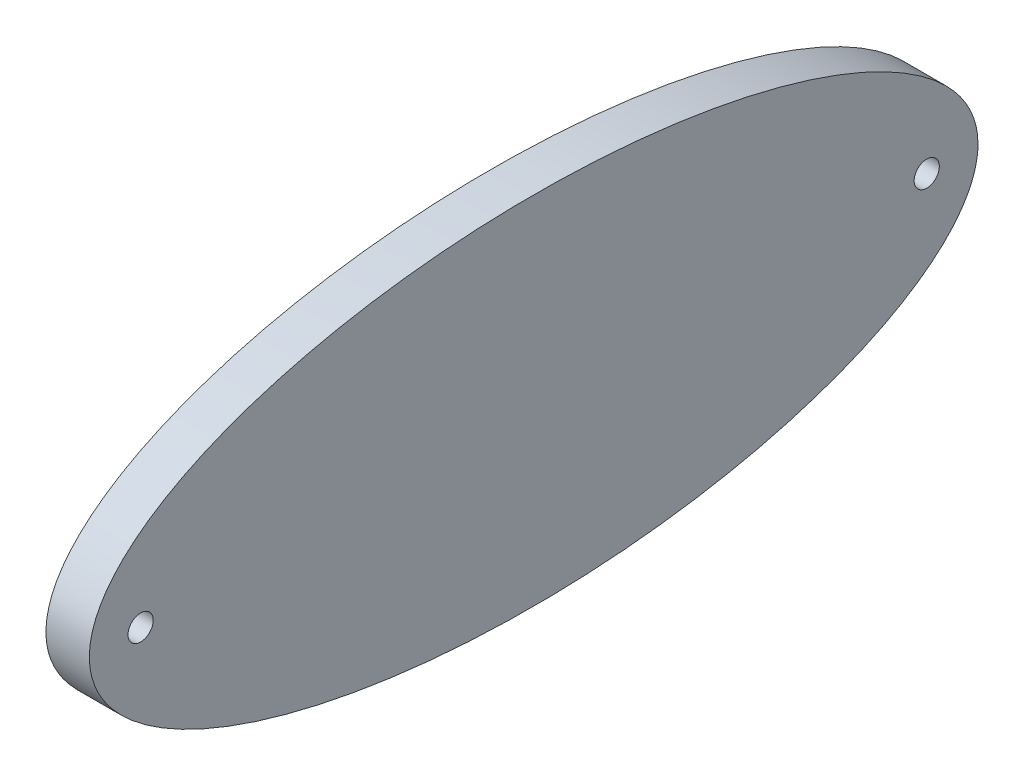
ISO-10303-21;
HEADER;
FILE_DESCRIPTION(('STEP AP214'),'2;1');
FILE_NAME('part.step','',(''),(''),'','','');
FILE_SCHEMA(('AUTOMOTIVE_DESIGN { 1 0 10303 214 1 1 1 1 }'));
ENDSEC;
DATA;
#1=APPLICATION_CONTEXT('core data for automotive mechanical design processes');
#2=APPLICATION_PROTOCOL_DEFINITION('international standard','automotive_design',2000,#1);
#3=PRODUCT_CONTEXT('',#1,'mechanical');
#4=PRODUCT('Part','Part','',(#3));
#5=PRODUCT_RELATED_PRODUCT_CATEGORY('part','',(#4));
#6=PRODUCT_DEFINITION_FORMATION('','',#4);
#7=PRODUCT_DEFINITION_CONTEXT('part definition',#1,'design');
#8=PRODUCT_DEFINITION('design','',#6,#7);
#9=PRODUCT_DEFINITION_SHAPE('','',#8);
#10=(LENGTH_UNIT() NAMED_UNIT(*) SI_UNIT(.MILLI.,.METRE.));
#11=(NAMED_UNIT(*) PLANE_ANGLE_UNIT() SI_UNIT($,.RADIAN.));
#12=(NAMED_UNIT(*) SI_UNIT($,.STERADIAN.) SOLID_ANGLE_UNIT());
#13=UNCERTAINTY_MEASURE_WITH_UNIT(LENGTH_MEASURE(1.E-05),#10,'distance_accuracy_value','');
#14=(GEOMETRIC_REPRESENTATION_CONTEXT(3) GLOBAL_UNCERTAINTY_ASSIGNED_CONTEXT((#13)) GLOBAL_UNIT_ASSIGNED_CONTEXT((#10,
#11,#12)) REPRESENTATION_CONTEXT('',''));
#15=CARTESIAN_POINT('',(0.,0.,0.));
#16=DIRECTION('',(0.,0.,1.));
#17=DIRECTION('',(1.,0.,0.));
#18=AXIS2_PLACEMENT_3D('',#15,#16,#17);
#19=CARTESIAN_POINT('',(5.08,0.,0.));
#20=DIRECTION('',(1.,0.,0.));
#21=DIRECTION('',(0.,0.,-1.));
#22=AXIS2_PLACEMENT_3D('',#19,#20,#21);
#23=PLANE('',#22);
#24=CARTESIAN_POINT('',(5.08,0.,46.));
#25=DIRECTION('',(1.,0.,0.));
#26=DIRECTION('',(0.,0.,-1.));
#27=AXIS2_PLACEMENT_3D('',#24,#25,#26);
#28=CIRCLE('',#27,1.4732);
#29=CARTESIAN_POINT('',(5.08,0.,44.5268));
#30=VERTEX_POINT('',#29);
#31=EDGE_CURVE('E42',#30,#30,#28,.T.);
#32=ORIENTED_EDGE('',*,*,#31,.F.);
#33=EDGE_LOOP('',(#32));
#34=FACE_BOUND('',#33,.T.);
#35=CARTESIAN_POINT('',(5.08,0.,0.));
#36=DIRECTION('',(1.,0.,0.));
#37=DIRECTION('',(0.,0.,-1.));
#38=AXIS2_PLACEMENT_3D('',#35,#36,#37);
#39=ELLIPSE('',#38,52.,20.85);
#40=CARTESIAN_POINT('',(5.08,0.,-52.));
#41=VERTEX_POINT('',#40);
#42=EDGE_CURVE('E10',#41,#41,#39,.T.);
#43=ORIENTED_EDGE('',*,*,#42,.T.);
#44=EDGE_LOOP('',(#43));
#45=FACE_BOUND('',#44,.T.);
#46=CARTESIAN_POINT('',(5.08,0.,-46.));
#47=DIRECTION('',(1.,0.,0.));
#48=DIRECTION('',(0.,0.,-1.));
#49=AXIS2_PLACEMENT_3D('',#46,#47,#48);
#50=CIRCLE('',#49,1.4732);
#51=CARTESIAN_POINT('',(5.08,0.,-47.4732));
#52=VERTEX_POINT('',#51);
#53=EDGE_CURVE('E48',#52,#52,#50,.T.);
#54=ORIENTED_EDGE('',*,*,#53,.F.);
#55=EDGE_LOOP('',(#54));
#56=FACE_BOUND('',#55,.T.);
#57=ADVANCED_FACE('F31',(#34,#45,#56),#23,.T.);
#58=CARTESIAN_POINT('',(0.,0.,0.));
#59=DIRECTION('',(1.,0.,0.));
#60=DIRECTION('',(0.,0.,-1.));
#61=AXIS2_PLACEMENT_3D('',#58,#59,#60);
#62=PLANE('',#61);
#63=CARTESIAN_POINT('',(0.,0.,0.));
#64=DIRECTION('',(1.,0.,0.));
#65=DIRECTION('',(0.,0.,-1.));
#66=AXIS2_PLACEMENT_3D('',#63,#64,#65);
#67=ELLIPSE('',#66,52.,20.85);
#68=CARTESIAN_POINT('',(0.,0.,-52.));
#69=VERTEX_POINT('',#68);
#70=EDGE_CURVE('E36',#69,#69,#67,.T.);
#71=ORIENTED_EDGE('',*,*,#70,.F.);
#72=EDGE_LOOP('',(#71));
#73=FACE_BOUND('',#72,.T.);
#74=CARTESIAN_POINT('',(0.,0.,46.));
#75=DIRECTION('',(1.,0.,0.));
#76=DIRECTION('',(0.,0.,-1.));
#77=AXIS2_PLACEMENT_3D('',#74,#75,#76);
#78=CIRCLE('',#77,1.4732);
#79=CARTESIAN_POINT('',(0.,0.,44.5268));
#80=VERTEX_POINT('',#79);
#81=EDGE_CURVE('E45',#80,#80,#78,.T.);
#82=ORIENTED_EDGE('',*,*,#81,.T.);
#83=EDGE_LOOP('',(#82));
#84=FACE_BOUND('',#83,.T.);
#85=CARTESIAN_POINT('',(0.,0.,-46.));
#86=DIRECTION('',(1.,0.,0.));
#87=DIRECTION('',(0.,0.,-1.));
#88=AXIS2_PLACEMENT_3D('',#85,#86,#87);
#89=CIRCLE('',#88,1.4732);
#90=CARTESIAN_POINT('',(0.,0.,-47.4732));
#91=VERTEX_POINT('',#90);
#92=EDGE_CURVE('E51',#91,#91,#89,.T.);
#93=ORIENTED_EDGE('',*,*,#92,.T.);
#94=EDGE_LOOP('',(#93));
#95=FACE_BOUND('',#94,.T.);
#96=ADVANCED_FACE('F61',(#73,#84,#95),#62,.F.);
#97=DIRECTION('',(-1.,0.,0.));
#98=VECTOR('',#97,1.);
#99=SURFACE_OF_LINEAR_EXTRUSION('',#39,#98);
#100=ORIENTED_EDGE('',*,*,#42,.F.);
#101=EDGE_LOOP('',(#100));
#102=FACE_BOUND('',#101,.T.);
#103=ORIENTED_EDGE('',*,*,#70,.T.);
#104=EDGE_LOOP('',(#103));
#105=FACE_BOUND('',#104,.T.);
#106=ADVANCED_FACE('F33',(#102,#105),#99,.F.);
#107=CARTESIAN_POINT('',(5.08,0.,46.));
#108=DIRECTION('',(-1.,0.,0.));
#109=DIRECTION('',(0.,0.,1.));
#110=AXIS2_PLACEMENT_3D('',#107,#108,#109);
#111=CYLINDRICAL_SURFACE('',#110,1.4732);
#112=ORIENTED_EDGE('',*,*,#31,.T.);
#113=EDGE_LOOP('',(#112));
#114=FACE_BOUND('',#113,.T.);
#115=ORIENTED_EDGE('',*,*,#81,.F.);
#116=EDGE_LOOP('',(#115));
#117=FACE_BOUND('',#116,.T.);
#118=ADVANCED_FACE('F70',(#114,#117),#111,.F.);
#119=CARTESIAN_POINT('',(5.08,0.,-46.));
#120=DIRECTION('',(-1.,0.,0.));
#121=DIRECTION('',(0.,0.,1.));
#122=AXIS2_PLACEMENT_3D('',#119,#120,#121);
#123=CYLINDRICAL_SURFACE('',#122,1.4732);
#124=ORIENTED_EDGE('',*,*,#53,.T.);
#125=EDGE_LOOP('',(#124));
#126=FACE_BOUND('',#125,.T.);
#127=ORIENTED_EDGE('',*,*,#92,.F.);
#128=EDGE_LOOP('',(#127));
#129=FACE_BOUND('',#128,.T.);
#130=ADVANCED_FACE('F57',(#126,#129),#123,.F.);
#131=CLOSED_SHELL('',(#57,#96,#106,#118,#130));
#132=MANIFOLD_SOLID_BREP('B2',#131);
#133=ADVANCED_BREP_SHAPE_REPRESENTATION('',(#18,#132),#14);
#134=SHAPE_DEFINITION_REPRESENTATION(#9,#133);
ENDSEC;
END-ISO-10303-21;
